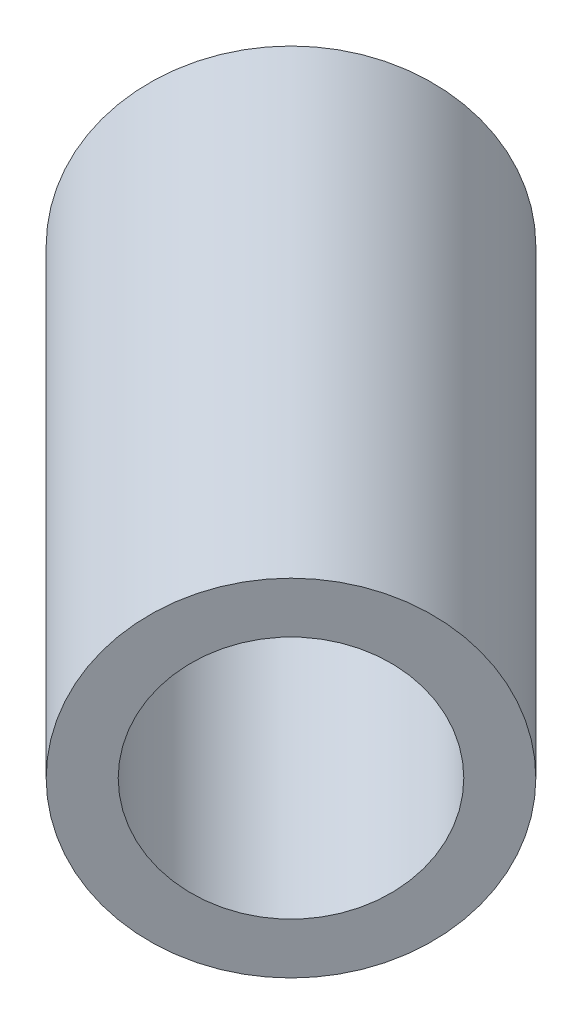
ISO-10303-21;
HEADER;
FILE_DESCRIPTION(('STEP AP214'),'2;1');
FILE_NAME('part.step','',(''),(''),'','','');
FILE_SCHEMA(('AUTOMOTIVE_DESIGN { 1 0 10303 214 1 1 1 1 }'));
ENDSEC;
DATA;
#1=APPLICATION_CONTEXT('core data for automotive mechanical design processes');
#2=APPLICATION_PROTOCOL_DEFINITION('international standard','automotive_design',2000,#1);
#3=PRODUCT_CONTEXT('',#1,'mechanical');
#4=PRODUCT('Part','Part','',(#3));
#5=PRODUCT_RELATED_PRODUCT_CATEGORY('part','',(#4));
#6=PRODUCT_DEFINITION_FORMATION('','',#4);
#7=PRODUCT_DEFINITION_CONTEXT('part definition',#1,'design');
#8=PRODUCT_DEFINITION('design','',#6,#7);
#9=PRODUCT_DEFINITION_SHAPE('','',#8);
#10=(LENGTH_UNIT() NAMED_UNIT(*) SI_UNIT(.MILLI.,.METRE.));
#11=(NAMED_UNIT(*) PLANE_ANGLE_UNIT() SI_UNIT($,.RADIAN.));
#12=(NAMED_UNIT(*) SI_UNIT($,.STERADIAN.) SOLID_ANGLE_UNIT());
#13=UNCERTAINTY_MEASURE_WITH_UNIT(LENGTH_MEASURE(1.E-05),#10,'distance_accuracy_value','');
#14=(GEOMETRIC_REPRESENTATION_CONTEXT(3) GLOBAL_UNCERTAINTY_ASSIGNED_CONTEXT((#13)) GLOBAL_UNIT_ASSIGNED_CONTEXT((#10,
#11,#12)) REPRESENTATION_CONTEXT('',''));
#15=CARTESIAN_POINT('',(0.,0.,0.));
#16=DIRECTION('',(0.,0.,1.));
#17=DIRECTION('',(1.,0.,0.));
#18=AXIS2_PLACEMENT_3D('',#15,#16,#17);
#19=CARTESIAN_POINT('',(0.,0.,0.));
#20=DIRECTION('',(-0.707106781186548,0.,-0.707106781186547));
#21=DIRECTION('',(-0.707106781186547,0.,0.707106781186548));
#22=AXIS2_PLACEMENT_3D('',#19,#20,#21);
#23=PLANE('',#22);
#24=CARTESIAN_POINT('',(0.,0.,0.));
#25=DIRECTION('',(-0.707106781186548,0.,-0.707106781186547));
#26=DIRECTION('',(-0.707106781186547,0.,0.707106781186548));
#27=AXIS2_PLACEMENT_3D('',#24,#25,#26);
#28=CIRCLE('',#27,9.525);
#29=CARTESIAN_POINT('',(-6.73519209080186,0.,6.73519209080187));
#30=VERTEX_POINT('',#29);
#31=EDGE_CURVE('E58',#30,#30,#28,.F.);
#32=ORIENTED_EDGE('',*,*,#31,.F.);
#33=EDGE_LOOP('',(#32));
#34=FACE_BOUND('',#33,.T.);
#35=CARTESIAN_POINT('',(0.,0.,0.));
#36=DIRECTION('',(-0.707106781186548,0.,-0.707106781186547));
#37=DIRECTION('',(-0.707106781186547,0.,0.707106781186548));
#38=AXIS2_PLACEMENT_3D('',#35,#36,#37);
#39=CIRCLE('',#38,13.49375);
#40=CARTESIAN_POINT('',(-9.54152212863597,0.,9.54152212863598));
#41=VERTEX_POINT('',#40);
#42=EDGE_CURVE('E50',#41,#41,#39,.T.);
#43=ORIENTED_EDGE('',*,*,#42,.F.);
#44=EDGE_LOOP('',(#43));
#45=FACE_BOUND('',#44,.T.);
#46=ADVANCED_FACE('F44',(#34,#45),#23,.F.);
#47=CARTESIAN_POINT('',(-35.9210244842766,0.,-35.9210244842766));
#48=DIRECTION('',(-0.707106781186548,0.,-0.707106781186547));
#49=DIRECTION('',(-0.707106781186547,0.,0.707106781186548));
#50=AXIS2_PLACEMENT_3D('',#47,#48,#49);
#51=PLANE('',#50);
#52=CARTESIAN_POINT('',(-35.9210244842766,0.,-35.9210244842766));
#53=DIRECTION('',(-0.707106781186548,0.,-0.707106781186547));
#54=DIRECTION('',(-0.707106781186547,0.,0.707106781186548));
#55=AXIS2_PLACEMENT_3D('',#52,#53,#54);
#56=CIRCLE('',#55,9.525);
#57=CARTESIAN_POINT('',(-42.6562165750785,0.,-29.1858323934747));
#58=VERTEX_POINT('',#57);
#59=EDGE_CURVE('E54',#58,#58,#56,.F.);
#60=ORIENTED_EDGE('',*,*,#59,.T.);
#61=EDGE_LOOP('',(#60));
#62=FACE_BOUND('',#61,.T.);
#63=CARTESIAN_POINT('',(-35.9210244842766,0.,-35.9210244842766));
#64=DIRECTION('',(-0.707106781186548,0.,-0.707106781186547));
#65=DIRECTION('',(-0.707106781186547,0.,0.707106781186548));
#66=AXIS2_PLACEMENT_3D('',#63,#64,#65);
#67=CIRCLE('',#66,13.49375);
#68=CARTESIAN_POINT('',(-45.4625466129126,0.,-26.3795023556406));
#69=VERTEX_POINT('',#68);
#70=EDGE_CURVE('E11',#69,#69,#67,.T.);
#71=ORIENTED_EDGE('',*,*,#70,.T.);
#72=EDGE_LOOP('',(#71));
#73=FACE_BOUND('',#72,.T.);
#74=ADVANCED_FACE('F69',(#62,#73),#51,.T.);
#75=CARTESIAN_POINT('',(0.,0.,0.));
#76=DIRECTION('',(-0.707106781186548,0.,-0.707106781186548));
#77=DIRECTION('',(-0.707106781186548,0.,0.707106781186548));
#78=AXIS2_PLACEMENT_3D('',#75,#76,#77);
#79=CYLINDRICAL_SURFACE('',#78,13.49375);
#80=ORIENTED_EDGE('',*,*,#70,.F.);
#81=EDGE_LOOP('',(#80));
#82=FACE_BOUND('',#81,.T.);
#83=ORIENTED_EDGE('',*,*,#42,.T.);
#84=EDGE_LOOP('',(#83));
#85=FACE_BOUND('',#84,.T.);
#86=ADVANCED_FACE('F73',(#82,#85),#79,.T.);
#87=CARTESIAN_POINT('',(3.53553390593274,0.,3.53553390593274));
#88=DIRECTION('',(-0.707106781186548,0.,-0.707106781186548));
#89=DIRECTION('',(-0.707106781186548,0.,0.707106781186548));
#90=AXIS2_PLACEMENT_3D('',#87,#88,#89);
#91=CYLINDRICAL_SURFACE('',#90,9.525);
#92=ORIENTED_EDGE('',*,*,#31,.T.);
#93=EDGE_LOOP('',(#92));
#94=FACE_BOUND('',#93,.T.);
#95=ORIENTED_EDGE('',*,*,#59,.F.);
#96=EDGE_LOOP('',(#95));
#97=FACE_BOUND('',#96,.T.);
#98=ADVANCED_FACE('F64',(#94,#97),#91,.F.);
#99=CLOSED_SHELL('',(#46,#74,#86,#98));
#100=MANIFOLD_SOLID_BREP('B2',#99);
#101=ADVANCED_BREP_SHAPE_REPRESENTATION('',(#18,#100),#14);
#102=SHAPE_DEFINITION_REPRESENTATION(#9,#101);
ENDSEC;
END-ISO-10303-21;
